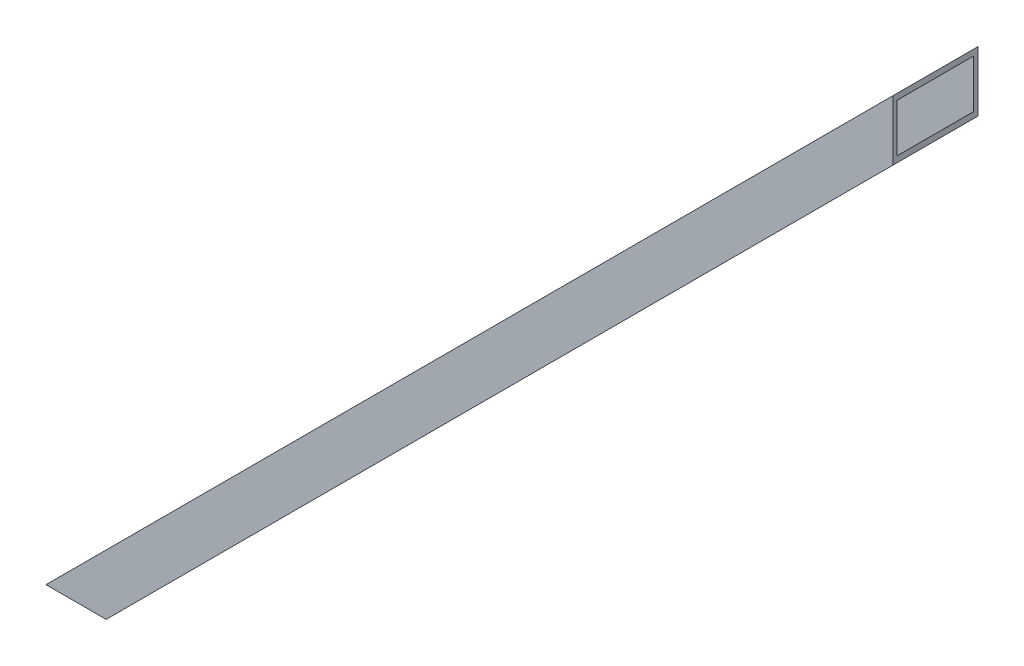
ISO-10303-21;
HEADER;
FILE_DESCRIPTION(('STEP AP214'),'2;1');
FILE_NAME('part.step','',(''),(''),'','','');
FILE_SCHEMA(('AUTOMOTIVE_DESIGN { 1 0 10303 214 1 1 1 1 }'));
ENDSEC;
DATA;
#1=APPLICATION_CONTEXT('core data for automotive mechanical design processes');
#2=APPLICATION_PROTOCOL_DEFINITION('international standard','automotive_design',2000,#1);
#3=PRODUCT_CONTEXT('',#1,'mechanical');
#4=PRODUCT('Part','Part','',(#3));
#5=PRODUCT_RELATED_PRODUCT_CATEGORY('part','',(#4));
#6=PRODUCT_DEFINITION_FORMATION('','',#4);
#7=PRODUCT_DEFINITION_CONTEXT('part definition',#1,'design');
#8=PRODUCT_DEFINITION('design','',#6,#7);
#9=PRODUCT_DEFINITION_SHAPE('','',#8);
#10=(LENGTH_UNIT() NAMED_UNIT(*) SI_UNIT(.MILLI.,.METRE.));
#11=(NAMED_UNIT(*) PLANE_ANGLE_UNIT() SI_UNIT($,.RADIAN.));
#12=(NAMED_UNIT(*) SI_UNIT($,.STERADIAN.) SOLID_ANGLE_UNIT());
#13=UNCERTAINTY_MEASURE_WITH_UNIT(LENGTH_MEASURE(1.E-05),#10,'distance_accuracy_value','');
#14=(GEOMETRIC_REPRESENTATION_CONTEXT(3) GLOBAL_UNCERTAINTY_ASSIGNED_CONTEXT((#13)) GLOBAL_UNIT_ASSIGNED_CONTEXT((#10,
#11,#12)) REPRESENTATION_CONTEXT('',''));
#15=CARTESIAN_POINT('',(0.,0.,0.));
#16=DIRECTION('',(0.,0.,1.));
#17=DIRECTION('',(1.,0.,0.));
#18=AXIS2_PLACEMENT_3D('',#15,#16,#17);
#19=CARTESIAN_POINT('',(0.,20.,10.));
#20=DIRECTION('',(0.,1.,0.));
#21=DIRECTION('',(0.,0.,1.));
#22=AXIS2_PLACEMENT_3D('',#19,#20,#21);
#23=PLANE('',#22);
#24=DIRECTION('',(0.,0.,-1.));
#25=VECTOR('',#24,1.);
#26=CARTESIAN_POINT('',(-1.41421356237314,20.,10.));
#27=LINE('',#26,#25);
#28=CARTESIAN_POINT('',(-1.41421356237315,20.,9.));
#29=VERTEX_POINT('',#28);
#30=CARTESIAN_POINT('',(-1.41421356237313,20.,-9.));
#31=VERTEX_POINT('',#30);
#32=EDGE_CURVE('E100',#29,#31,#27,.T.);
#33=ORIENTED_EDGE('',*,*,#32,.T.);
#34=DIRECTION('',(-1.,0.,0.));
#35=VECTOR('',#34,1.);
#36=CARTESIAN_POINT('',(0.,20.,-9.));
#37=LINE('',#36,#35);
#38=CARTESIAN_POINT('',(-12.7279220613579,20.,-9.));
#39=VERTEX_POINT('',#38);
#40=EDGE_CURVE('E121',#31,#39,#37,.T.);
#41=ORIENTED_EDGE('',*,*,#40,.T.);
#42=DIRECTION('',(0.,0.,1.));
#43=VECTOR('',#42,1.);
#44=CARTESIAN_POINT('',(-12.7279220613579,20.,10.));
#45=LINE('',#44,#43);
#46=CARTESIAN_POINT('',(-12.7279220613579,20.,9.));
#47=VERTEX_POINT('',#46);
#48=EDGE_CURVE('E119',#39,#47,#45,.T.);
#49=ORIENTED_EDGE('',*,*,#48,.T.);
#50=DIRECTION('',(1.,0.,0.));
#51=VECTOR('',#50,1.);
#52=CARTESIAN_POINT('',(0.,20.,9.));
#53=LINE('',#52,#51);
#54=EDGE_CURVE('E105',#47,#29,#53,.T.);
#55=ORIENTED_EDGE('',*,*,#54,.T.);
#56=EDGE_LOOP('',(#33,#41,#49,#55));
#57=FACE_BOUND('',#56,.T.);
#58=DIRECTION('',(1.,0.,0.));
#59=VECTOR('',#58,1.);
#60=CARTESIAN_POINT('',(0.,20.,-10.));
#61=LINE('',#60,#59);
#62=CARTESIAN_POINT('',(-14.1421356237309,20.,-10.));
#63=VERTEX_POINT('',#62);
#64=CARTESIAN_POINT('',(0.,20.,-10.));
#65=VERTEX_POINT('',#64);
#66=EDGE_CURVE('E126',#63,#65,#61,.T.);
#67=ORIENTED_EDGE('',*,*,#66,.T.);
#68=DIRECTION('',(0.,0.,-1.));
#69=VECTOR('',#68,1.);
#70=CARTESIAN_POINT('',(0.,20.,10.));
#71=LINE('',#70,#69);
#72=CARTESIAN_POINT('',(0.,20.,10.));
#73=VERTEX_POINT('',#72);
#74=EDGE_CURVE('E153',#73,#65,#71,.T.);
#75=ORIENTED_EDGE('',*,*,#74,.F.);
#76=DIRECTION('',(1.,0.,0.));
#77=VECTOR('',#76,1.);
#78=CARTESIAN_POINT('',(0.,20.,10.));
#79=LINE('',#78,#77);
#80=CARTESIAN_POINT('',(-14.1421356237309,20.,10.));
#81=VERTEX_POINT('',#80);
#82=EDGE_CURVE('E127',#81,#73,#79,.T.);
#83=ORIENTED_EDGE('',*,*,#82,.F.);
#84=DIRECTION('',(0.,0.,-1.));
#85=VECTOR('',#84,1.);
#86=CARTESIAN_POINT('',(-14.1421356237309,20.,10.));
#87=LINE('',#86,#85);
#88=EDGE_CURVE('E137',#81,#63,#87,.T.);
#89=ORIENTED_EDGE('',*,*,#88,.T.);
#90=EDGE_LOOP('',(#67,#75,#83,#89));
#91=FACE_BOUND('',#90,.T.);
#92=ADVANCED_FACE('F37',(#57,#91),#23,.F.);
#93=CARTESIAN_POINT('',(0.,20.,10.));
#94=DIRECTION('',(-0.707106781186549,0.707106781186546,0.));
#95=DIRECTION('',(-0.707106781186546,-0.707106781186549,0.));
#96=AXIS2_PLACEMENT_3D('',#93,#94,#95);
#97=PLANE('',#96);
#98=CARTESIAN_POINT('',(165.201010126777,185.201010126777,-6.));
#99=DIRECTION('',(-0.707106781186549,0.707106781186546,0.));
#100=DIRECTION('',(-0.707106781186546,-0.707106781186549,0.));
#101=AXIS2_PLACEMENT_3D('',#98,#99,#100);
#102=CIRCLE('',#101,1.59999999999997);
#103=CARTESIAN_POINT('',(164.069639276878,184.069639276879,-6.));
#104=VERTEX_POINT('',#103);
#105=EDGE_CURVE('E182',#104,#104,#102,.T.);
#106=ORIENTED_EDGE('',*,*,#105,.T.);
#107=EDGE_LOOP('',(#106));
#108=FACE_BOUND('',#107,.T.);
#109=CARTESIAN_POINT('',(165.201010126777,185.201010126777,6.));
#110=DIRECTION('',(-0.707106781186549,0.707106781186546,0.));
#111=DIRECTION('',(-0.707106781186546,-0.707106781186549,0.));
#112=AXIS2_PLACEMENT_3D('',#109,#110,#111);
#113=CIRCLE('',#112,1.59999999999997);
#114=CARTESIAN_POINT('',(164.069639276878,184.069639276879,6.));
#115=VERTEX_POINT('',#114);
#116=EDGE_CURVE('E167',#115,#115,#113,.T.);
#117=ORIENTED_EDGE('',*,*,#116,.T.);
#118=EDGE_LOOP('',(#117));
#119=FACE_BOUND('',#118,.T.);
#120=DIRECTION('',(0.707106781186546,0.707106781186549,0.));
#121=VECTOR('',#120,1.);
#122=CARTESIAN_POINT('',(0.,20.,-10.));
#123=LINE('',#122,#121);
#124=CARTESIAN_POINT('',(185.,205.000000000001,-10.));
#125=VERTEX_POINT('',#124);
#126=EDGE_CURVE('E140',#65,#125,#123,.T.);
#127=ORIENTED_EDGE('',*,*,#126,.T.);
#128=DIRECTION('',(0.,0.,-1.));
#129=VECTOR('',#128,1.);
#130=CARTESIAN_POINT('',(185.,205.000000000001,10.));
#131=LINE('',#130,#129);
#132=CARTESIAN_POINT('',(185.,205.000000000001,10.));
#133=VERTEX_POINT('',#132);
#134=EDGE_CURVE('E150',#133,#125,#131,.T.);
#135=ORIENTED_EDGE('',*,*,#134,.F.);
#136=DIRECTION('',(0.707106781186546,0.707106781186549,0.));
#137=VECTOR('',#136,1.);
#138=CARTESIAN_POINT('',(0.,20.,10.));
#139=LINE('',#138,#137);
#140=EDGE_CURVE('E130',#73,#133,#139,.T.);
#141=ORIENTED_EDGE('',*,*,#140,.F.);
#142=ORIENTED_EDGE('',*,*,#74,.T.);
#143=EDGE_LOOP('',(#127,#135,#141,#142));
#144=FACE_BOUND('',#143,.T.);
#145=ADVANCED_FACE('F210',(#108,#119,#144),#97,.F.);
#146=CARTESIAN_POINT('',(185.,219.142135623732,10.));
#147=DIRECTION('',(-1.,0.,0.));
#148=DIRECTION('',(0.,0.,1.));
#149=AXIS2_PLACEMENT_3D('',#146,#147,#148);
#150=PLANE('',#149);
#151=DIRECTION('',(0.,0.,-1.));
#152=VECTOR('',#151,1.);
#153=CARTESIAN_POINT('',(185.,217.727922061359,10.));
#154=LINE('',#153,#152);
#155=CARTESIAN_POINT('',(185.,217.727922061359,9.));
#156=VERTEX_POINT('',#155);
#157=CARTESIAN_POINT('',(185.,217.727922061359,-9.));
#158=VERTEX_POINT('',#157);
#159=EDGE_CURVE('E45',#156,#158,#154,.T.);
#160=ORIENTED_EDGE('',*,*,#159,.T.);
#161=DIRECTION('',(0.,-1.,0.));
#162=VECTOR('',#161,1.);
#163=CARTESIAN_POINT('',(185.,219.142135623732,-9.));
#164=LINE('',#163,#162);
#165=CARTESIAN_POINT('',(185.,206.414213562374,-9.));
#166=VERTEX_POINT('',#165);
#167=EDGE_CURVE('E11',#158,#166,#164,.T.);
#168=ORIENTED_EDGE('',*,*,#167,.T.);
#169=DIRECTION('',(0.,0.,1.));
#170=VECTOR('',#169,1.);
#171=CARTESIAN_POINT('',(185.,206.414213562374,10.));
#172=LINE('',#171,#170);
#173=CARTESIAN_POINT('',(185.,206.414213562374,9.));
#174=VERTEX_POINT('',#173);
#175=EDGE_CURVE('E156',#166,#174,#172,.T.);
#176=ORIENTED_EDGE('',*,*,#175,.T.);
#177=DIRECTION('',(0.,1.,0.));
#178=VECTOR('',#177,1.);
#179=CARTESIAN_POINT('',(185.,219.142135623732,9.));
#180=LINE('',#179,#178);
#181=EDGE_CURVE('E113',#174,#156,#180,.T.);
#182=ORIENTED_EDGE('',*,*,#181,.T.);
#183=EDGE_LOOP('',(#160,#168,#176,#182));
#184=FACE_BOUND('',#183,.T.);
#185=DIRECTION('',(0.,1.,0.));
#186=VECTOR('',#185,1.);
#187=CARTESIAN_POINT('',(185.,219.142135623732,-10.));
#188=LINE('',#187,#186);
#189=CARTESIAN_POINT('',(185.,219.142135623732,-10.));
#190=VERTEX_POINT('',#189);
#191=EDGE_CURVE('E142',#125,#190,#188,.T.);
#192=ORIENTED_EDGE('',*,*,#191,.T.);
#193=DIRECTION('',(0.,0.,-1.));
#194=VECTOR('',#193,1.);
#195=CARTESIAN_POINT('',(185.,219.142135623732,10.));
#196=LINE('',#195,#194);
#197=CARTESIAN_POINT('',(185.,219.142135623732,10.));
#198=VERTEX_POINT('',#197);
#199=EDGE_CURVE('E147',#198,#190,#196,.T.);
#200=ORIENTED_EDGE('',*,*,#199,.F.);
#201=DIRECTION('',(0.,1.,0.));
#202=VECTOR('',#201,1.);
#203=CARTESIAN_POINT('',(185.,219.142135623732,10.));
#204=LINE('',#203,#202);
#205=EDGE_CURVE('E133',#133,#198,#204,.T.);
#206=ORIENTED_EDGE('',*,*,#205,.F.);
#207=ORIENTED_EDGE('',*,*,#134,.T.);
#208=EDGE_LOOP('',(#192,#200,#206,#207));
#209=FACE_BOUND('',#208,.T.);
#210=ADVANCED_FACE('F191',(#184,#209),#150,.F.);
#211=CARTESIAN_POINT('',(-14.1421356237309,20.,10.));
#212=DIRECTION('',(0.707106781186549,-0.707106781186546,0.));
#213=DIRECTION('',(0.707106781186546,0.707106781186549,0.));
#214=AXIS2_PLACEMENT_3D('',#211,#212,#213);
#215=PLANE('',#214);
#216=CARTESIAN_POINT('',(158.129942314911,192.272077938643,-6.));
#217=DIRECTION('',(-0.707106781186549,0.707106781186546,0.));
#218=DIRECTION('',(-0.707106781186546,-0.707106781186549,0.));
#219=AXIS2_PLACEMENT_3D('',#216,#217,#218);
#220=CIRCLE('',#219,1.59999999999997);
#221=CARTESIAN_POINT('',(156.998571465013,191.140707088744,-6.));
#222=VERTEX_POINT('',#221);
#223=EDGE_CURVE('E163',#222,#222,#220,.T.);
#224=ORIENTED_EDGE('',*,*,#223,.F.);
#225=EDGE_LOOP('',(#224));
#226=FACE_BOUND('',#225,.T.);
#227=CARTESIAN_POINT('',(158.129942314911,192.272077938643,6.));
#228=DIRECTION('',(-0.707106781186549,0.707106781186546,0.));
#229=DIRECTION('',(0.707106781186546,0.707106781186549,0.));
#230=AXIS2_PLACEMENT_3D('',#227,#228,#229);
#231=CIRCLE('',#230,1.59999999999997);
#232=CARTESIAN_POINT('',(159.26131316481,193.403448788541,6.));
#233=VERTEX_POINT('',#232);
#234=EDGE_CURVE('E170',#233,#233,#231,.T.);
#235=ORIENTED_EDGE('',*,*,#234,.F.);
#236=EDGE_LOOP('',(#235));
#237=FACE_BOUND('',#236,.T.);
#238=DIRECTION('',(-0.707106781186546,-0.707106781186549,0.));
#239=VECTOR('',#238,1.);
#240=CARTESIAN_POINT('',(-14.1421356237309,20.,-10.));
#241=LINE('',#240,#239);
#242=EDGE_CURVE('E131',#190,#63,#241,.T.);
#243=ORIENTED_EDGE('',*,*,#242,.T.);
#244=ORIENTED_EDGE('',*,*,#88,.F.);
#245=DIRECTION('',(-0.707106781186546,-0.707106781186549,0.));
#246=VECTOR('',#245,1.);
#247=CARTESIAN_POINT('',(-14.1421356237309,20.,10.));
#248=LINE('',#247,#246);
#249=EDGE_CURVE('E135',#198,#81,#248,.T.);
#250=ORIENTED_EDGE('',*,*,#249,.F.);
#251=ORIENTED_EDGE('',*,*,#199,.T.);
#252=EDGE_LOOP('',(#243,#244,#250,#251));
#253=FACE_BOUND('',#252,.T.);
#254=ADVANCED_FACE('F218',(#226,#237,#253),#215,.F.);
#255=CARTESIAN_POINT('',(0.,0.,10.));
#256=DIRECTION('',(0.,0.,1.));
#257=DIRECTION('',(1.,0.,0.));
#258=AXIS2_PLACEMENT_3D('',#255,#256,#257);
#259=PLANE('',#258);
#260=ORIENTED_EDGE('',*,*,#82,.T.);
#261=ORIENTED_EDGE('',*,*,#140,.T.);
#262=ORIENTED_EDGE('',*,*,#205,.T.);
#263=ORIENTED_EDGE('',*,*,#249,.T.);
#264=EDGE_LOOP('',(#260,#261,#262,#263));
#265=FACE_BOUND('',#264,.T.);
#266=ADVANCED_FACE('F204',(#265),#259,.T.);
#267=CARTESIAN_POINT('',(0.,0.,-10.));
#268=DIRECTION('',(0.,0.,1.));
#269=DIRECTION('',(1.,0.,0.));
#270=AXIS2_PLACEMENT_3D('',#267,#268,#269);
#271=PLANE('',#270);
#272=ORIENTED_EDGE('',*,*,#66,.F.);
#273=ORIENTED_EDGE('',*,*,#242,.F.);
#274=ORIENTED_EDGE('',*,*,#191,.F.);
#275=ORIENTED_EDGE('',*,*,#126,.F.);
#276=EDGE_LOOP('',(#272,#273,#274,#275));
#277=FACE_BOUND('',#276,.T.);
#278=ADVANCED_FACE('F196',(#277),#271,.F.);
#279=CARTESIAN_POINT('',(202.071067811866,202.071067811866,-9.));
#280=DIRECTION('',(0.,0.,-1.));
#281=DIRECTION('',(-1.,0.,0.));
#282=AXIS2_PLACEMENT_3D('',#279,#280,#281);
#283=PLANE('',#282);
#284=DIRECTION('',(-0.707106781186546,-0.707106781186549,0.));
#285=VECTOR('',#284,1.);
#286=CARTESIAN_POINT('',(191.363961030679,212.778174593053,-9.));
#287=LINE('',#286,#285);
#288=EDGE_CURVE('E53',#166,#31,#287,.T.);
#289=ORIENTED_EDGE('',*,*,#288,.F.);
#290=ORIENTED_EDGE('',*,*,#167,.F.);
#291=DIRECTION('',(-0.707106781186546,-0.707106781186549,0.));
#292=VECTOR('',#291,1.);
#293=CARTESIAN_POINT('',(185.707106781187,218.435028842545,-9.));
#294=LINE('',#293,#292);
#295=EDGE_CURVE('E106',#158,#39,#294,.T.);
#296=ORIENTED_EDGE('',*,*,#295,.T.);
#297=ORIENTED_EDGE('',*,*,#40,.F.);
#298=EDGE_LOOP('',(#289,#290,#296,#297));
#299=FACE_BOUND('',#298,.T.);
#300=ADVANCED_FACE('F194',(#299),#283,.F.);
#301=CARTESIAN_POINT('',(185.707106781187,218.435028842545,0.));
#302=DIRECTION('',(-0.707106781186549,0.707106781186546,0.));
#303=DIRECTION('',(-0.707106781186546,-0.707106781186549,0.));
#304=AXIS2_PLACEMENT_3D('',#301,#302,#303);
#305=PLANE('',#304);
#306=CARTESIAN_POINT('',(158.837049096098,191.564971157456,-6.));
#307=DIRECTION('',(-0.707106781186549,0.707106781186546,0.));
#308=DIRECTION('',(-0.707106781186546,-0.707106781186549,0.));
#309=AXIS2_PLACEMENT_3D('',#306,#307,#308);
#310=CIRCLE('',#309,1.59999999999997);
#311=CARTESIAN_POINT('',(157.705678246199,190.433600307558,-6.));
#312=VERTEX_POINT('',#311);
#313=EDGE_CURVE('E179',#312,#312,#310,.T.);
#314=ORIENTED_EDGE('',*,*,#313,.T.);
#315=EDGE_LOOP('',(#314));
#316=FACE_BOUND('',#315,.T.);
#317=CARTESIAN_POINT('',(158.837049096098,191.564971157456,6.));
#318=DIRECTION('',(-0.707106781186549,0.707106781186546,0.));
#319=DIRECTION('',(-0.707106781186546,-0.707106781186549,0.));
#320=AXIS2_PLACEMENT_3D('',#317,#318,#319);
#321=CIRCLE('',#320,1.59999999999997);
#322=CARTESIAN_POINT('',(157.705678246199,190.433600307558,6.));
#323=VERTEX_POINT('',#322);
#324=EDGE_CURVE('E162',#323,#323,#321,.T.);
#325=ORIENTED_EDGE('',*,*,#324,.T.);
#326=EDGE_LOOP('',(#325));
#327=FACE_BOUND('',#326,.T.);
#328=ORIENTED_EDGE('',*,*,#295,.F.);
#329=ORIENTED_EDGE('',*,*,#159,.F.);
#330=DIRECTION('',(-0.707106781186546,-0.707106781186549,0.));
#331=VECTOR('',#330,1.);
#332=CARTESIAN_POINT('',(185.707106781187,218.435028842545,9.));
#333=LINE('',#332,#331);
#334=EDGE_CURVE('E115',#156,#47,#333,.T.);
#335=ORIENTED_EDGE('',*,*,#334,.T.);
#336=ORIENTED_EDGE('',*,*,#48,.F.);
#337=EDGE_LOOP('',(#328,#329,#335,#336));
#338=FACE_BOUND('',#337,.T.);
#339=ADVANCED_FACE('F189',(#316,#327,#338),#305,.F.);
#340=CARTESIAN_POINT('',(202.071067811866,202.071067811866,9.));
#341=DIRECTION('',(0.,0.,1.));
#342=DIRECTION('',(1.,0.,0.));
#343=AXIS2_PLACEMENT_3D('',#340,#341,#342);
#344=PLANE('',#343);
#345=ORIENTED_EDGE('',*,*,#334,.F.);
#346=ORIENTED_EDGE('',*,*,#181,.F.);
#347=DIRECTION('',(-0.707106781186546,-0.707106781186549,0.));
#348=VECTOR('',#347,1.);
#349=CARTESIAN_POINT('',(191.363961030679,212.778174593053,9.));
#350=LINE('',#349,#348);
#351=EDGE_CURVE('E58',#174,#29,#350,.T.);
#352=ORIENTED_EDGE('',*,*,#351,.T.);
#353=ORIENTED_EDGE('',*,*,#54,.F.);
#354=EDGE_LOOP('',(#345,#346,#352,#353));
#355=FACE_BOUND('',#354,.T.);
#356=ADVANCED_FACE('F110',(#355),#344,.F.);
#357=CARTESIAN_POINT('',(191.363961030679,212.778174593053,0.));
#358=DIRECTION('',(0.707106781186549,-0.707106781186546,0.));
#359=DIRECTION('',(0.707106781186546,0.707106781186549,0.));
#360=AXIS2_PLACEMENT_3D('',#357,#358,#359);
#361=PLANE('',#360);
#362=CARTESIAN_POINT('',(164.49390334559,185.908116907964,-6.));
#363=DIRECTION('',(0.707106781186549,-0.707106781186546,0.));
#364=DIRECTION('',(0.707106781186546,0.707106781186549,0.));
#365=AXIS2_PLACEMENT_3D('',#362,#363,#364);
#366=CIRCLE('',#365,1.59999999999997);
#367=CARTESIAN_POINT('',(165.625274195489,187.039487757862,-6.));
#368=VERTEX_POINT('',#367);
#369=EDGE_CURVE('E40',#368,#368,#366,.T.);
#370=ORIENTED_EDGE('',*,*,#369,.T.);
#371=EDGE_LOOP('',(#370));
#372=FACE_BOUND('',#371,.T.);
#373=CARTESIAN_POINT('',(164.49390334559,185.908116907964,6.));
#374=DIRECTION('',(0.707106781186549,-0.707106781186546,0.));
#375=DIRECTION('',(0.707106781186546,0.707106781186549,0.));
#376=AXIS2_PLACEMENT_3D('',#373,#374,#375);
#377=CIRCLE('',#376,1.59999999999997);
#378=CARTESIAN_POINT('',(165.625274195489,187.039487757862,6.));
#379=VERTEX_POINT('',#378);
#380=EDGE_CURVE('E160',#379,#379,#377,.T.);
#381=ORIENTED_EDGE('',*,*,#380,.T.);
#382=EDGE_LOOP('',(#381));
#383=FACE_BOUND('',#382,.T.);
#384=ORIENTED_EDGE('',*,*,#351,.F.);
#385=ORIENTED_EDGE('',*,*,#175,.F.);
#386=ORIENTED_EDGE('',*,*,#288,.T.);
#387=ORIENTED_EDGE('',*,*,#32,.F.);
#388=EDGE_LOOP('',(#384,#385,#386,#387));
#389=FACE_BOUND('',#388,.T.);
#390=ADVANCED_FACE('F101',(#372,#383,#389),#361,.F.);
#391=CARTESIAN_POINT('',(257.701010126777,92.7010101267774,6.));
#392=DIRECTION('',(-0.707106781186549,0.707106781186546,0.));
#393=DIRECTION('',(-0.707106781186546,-0.707106781186549,0.));
#394=AXIS2_PLACEMENT_3D('',#391,#392,#393);
#395=CYLINDRICAL_SURFACE('',#394,1.59999999999997);
#396=ORIENTED_EDGE('',*,*,#380,.F.);
#397=EDGE_LOOP('',(#396));
#398=FACE_BOUND('',#397,.T.);
#399=ORIENTED_EDGE('',*,*,#116,.F.);
#400=EDGE_LOOP('',(#399));
#401=FACE_BOUND('',#400,.T.);
#402=ADVANCED_FACE('F291',(#398,#401),#395,.F.);
#403=CARTESIAN_POINT('',(257.701010126777,92.7010101267774,-6.));
#404=DIRECTION('',(-0.707106781186549,0.707106781186546,0.));
#405=DIRECTION('',(-0.707106781186546,-0.707106781186549,0.));
#406=AXIS2_PLACEMENT_3D('',#403,#404,#405);
#407=CYLINDRICAL_SURFACE('',#406,1.59999999999997);
#408=ORIENTED_EDGE('',*,*,#369,.F.);
#409=EDGE_LOOP('',(#408));
#410=FACE_BOUND('',#409,.T.);
#411=ORIENTED_EDGE('',*,*,#105,.F.);
#412=EDGE_LOOP('',(#411));
#413=FACE_BOUND('',#412,.T.);
#414=ADVANCED_FACE('F300',(#410,#413),#407,.F.);
#415=ORIENTED_EDGE('',*,*,#234,.T.);
#416=EDGE_LOOP('',(#415));
#417=FACE_BOUND('',#416,.T.);
#418=ORIENTED_EDGE('',*,*,#324,.F.);
#419=EDGE_LOOP('',(#418));
#420=FACE_BOUND('',#419,.T.);
#421=ADVANCED_FACE('F303',(#417,#420),#395,.F.);
#422=ORIENTED_EDGE('',*,*,#223,.T.);
#423=EDGE_LOOP('',(#422));
#424=FACE_BOUND('',#423,.T.);
#425=ORIENTED_EDGE('',*,*,#313,.F.);
#426=EDGE_LOOP('',(#425));
#427=FACE_BOUND('',#426,.T.);
#428=ADVANCED_FACE('F313',(#424,#427),#407,.F.);
#429=CLOSED_SHELL('',(#92,#145,#210,#254,#266,#278,#300,#339,#356,#390,#402,#414,#421,#428));
#430=MANIFOLD_SOLID_BREP('B2',#429);
#431=ADVANCED_BREP_SHAPE_REPRESENTATION('',(#18,#430),#14);
#432=SHAPE_DEFINITION_REPRESENTATION(#9,#431);
ENDSEC;
END-ISO-10303-21;
